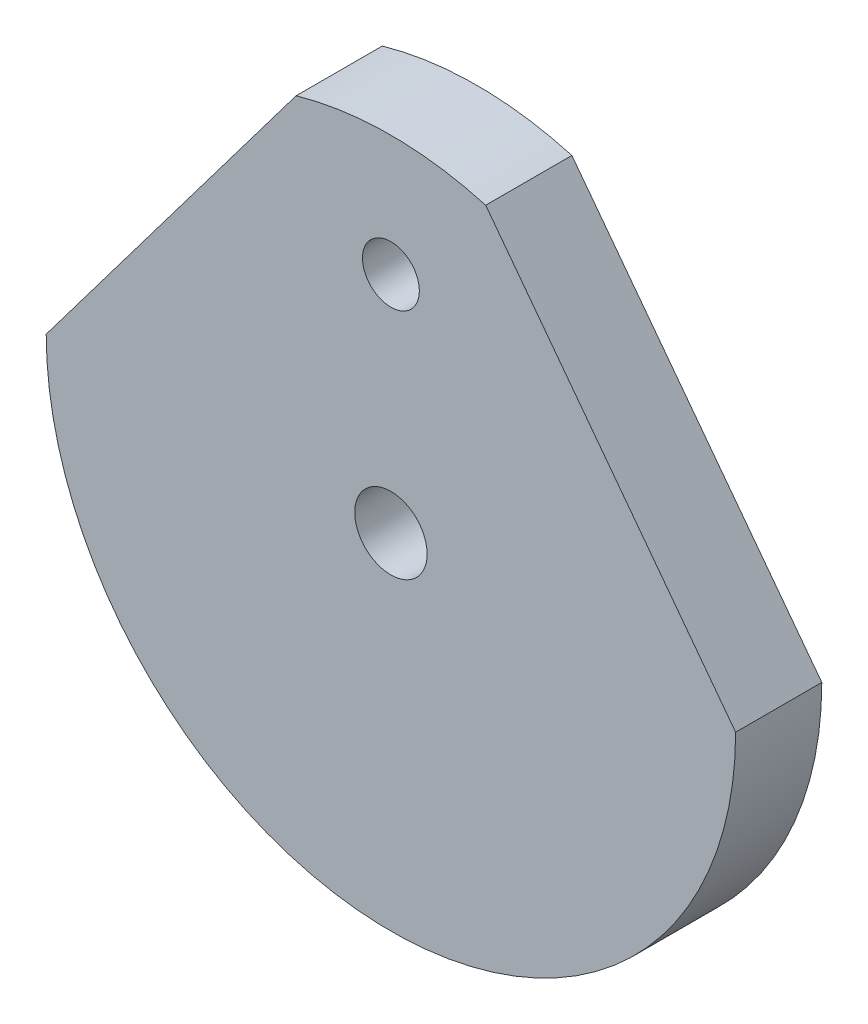
ISO-10303-21;
HEADER;
FILE_DESCRIPTION(('STEP AP214'),'2;1');
FILE_NAME('part.step','',(''),(''),'','','');
FILE_SCHEMA(('AUTOMOTIVE_DESIGN { 1 0 10303 214 1 1 1 1 }'));
ENDSEC;
DATA;
#1=APPLICATION_CONTEXT('core data for automotive mechanical design processes');
#2=APPLICATION_PROTOCOL_DEFINITION('international standard','automotive_design',2000,#1);
#3=PRODUCT_CONTEXT('',#1,'mechanical');
#4=PRODUCT('Part','Part','',(#3));
#5=PRODUCT_RELATED_PRODUCT_CATEGORY('part','',(#4));
#6=PRODUCT_DEFINITION_FORMATION('','',#4);
#7=PRODUCT_DEFINITION_CONTEXT('part definition',#1,'design');
#8=PRODUCT_DEFINITION('design','',#6,#7);
#9=PRODUCT_DEFINITION_SHAPE('','',#8);
#10=(LENGTH_UNIT() NAMED_UNIT(*) SI_UNIT(.MILLI.,.METRE.));
#11=(NAMED_UNIT(*) PLANE_ANGLE_UNIT() SI_UNIT($,.RADIAN.));
#12=(NAMED_UNIT(*) SI_UNIT($,.STERADIAN.) SOLID_ANGLE_UNIT());
#13=UNCERTAINTY_MEASURE_WITH_UNIT(LENGTH_MEASURE(1.E-05),#10,'distance_accuracy_value','');
#14=(GEOMETRIC_REPRESENTATION_CONTEXT(3) GLOBAL_UNCERTAINTY_ASSIGNED_CONTEXT((#13)) GLOBAL_UNIT_ASSIGNED_CONTEXT((#10,
#11,#12)) REPRESENTATION_CONTEXT('',''));
#15=CARTESIAN_POINT('',(0.,0.,0.));
#16=DIRECTION('',(0.,0.,1.));
#17=DIRECTION('',(1.,0.,0.));
#18=AXIS2_PLACEMENT_3D('',#15,#16,#17);
#19=CARTESIAN_POINT('',(12.75,9.6144422615147,2.5));
#20=DIRECTION('',(-0.798435971133566,-0.602079728939615,0.));
#21=DIRECTION('',(0.602079728939615,-0.798435971133566,0.));
#22=AXIS2_PLACEMENT_3D('',#19,#20,#21);
#23=PLANE('',#22);
#24=DIRECTION('',(-0.602079728939615,0.798435971133566,0.));
#25=VECTOR('',#24,1.);
#26=CARTESIAN_POINT('',(12.75,9.6144422615147,-2.5));
#27=LINE('',#26,#25);
#28=CARTESIAN_POINT('',(20.,0.,-2.5));
#29=VERTEX_POINT('',#28);
#30=CARTESIAN_POINT('',(5.5,19.2288845230294,-2.5));
#31=VERTEX_POINT('',#30);
#32=EDGE_CURVE('E101',#29,#31,#27,.T.);
#33=ORIENTED_EDGE('',*,*,#32,.T.);
#34=DIRECTION('',(0.,0.,-1.));
#35=VECTOR('',#34,1.);
#36=CARTESIAN_POINT('',(5.5,19.2288845230294,2.5));
#37=LINE('',#36,#35);
#38=CARTESIAN_POINT('',(5.5,19.2288845230294,2.5));
#39=VERTEX_POINT('',#38);
#40=EDGE_CURVE('E45',#39,#31,#37,.T.);
#41=ORIENTED_EDGE('',*,*,#40,.F.);
#42=DIRECTION('',(-0.602079728939615,0.798435971133566,0.));
#43=VECTOR('',#42,1.);
#44=CARTESIAN_POINT('',(12.75,9.6144422615147,2.5));
#45=LINE('',#44,#43);
#46=CARTESIAN_POINT('',(20.,0.,2.5));
#47=VERTEX_POINT('',#46);
#48=EDGE_CURVE('E85',#47,#39,#45,.T.);
#49=ORIENTED_EDGE('',*,*,#48,.F.);
#50=DIRECTION('',(0.,0.,-1.));
#51=VECTOR('',#50,1.);
#52=CARTESIAN_POINT('',(20.,0.,2.5));
#53=LINE('',#52,#51);
#54=EDGE_CURVE('E98',#47,#29,#53,.T.);
#55=ORIENTED_EDGE('',*,*,#54,.T.);
#56=EDGE_LOOP('',(#33,#41,#49,#55));
#57=FACE_BOUND('',#56,.T.);
#58=ADVANCED_FACE('F36',(#57),#23,.F.);
#59=CARTESIAN_POINT('',(0.,0.,2.5));
#60=DIRECTION('',(0.,0.,-1.));
#61=DIRECTION('',(-1.,0.,0.));
#62=AXIS2_PLACEMENT_3D('',#59,#60,#61);
#63=CYLINDRICAL_SURFACE('',#62,20.);
#64=CARTESIAN_POINT('',(0.,0.,-2.5));
#65=DIRECTION('',(0.,0.,1.));
#66=DIRECTION('',(1.,0.,0.));
#67=AXIS2_PLACEMENT_3D('',#64,#65,#66);
#68=CIRCLE('',#67,20.);
#69=CARTESIAN_POINT('',(-5.5,19.2288845230294,-2.5));
#70=VERTEX_POINT('',#69);
#71=EDGE_CURVE('E91',#31,#70,#68,.T.);
#72=ORIENTED_EDGE('',*,*,#71,.T.);
#73=DIRECTION('',(0.,0.,-1.));
#74=VECTOR('',#73,1.);
#75=CARTESIAN_POINT('',(-5.5,19.2288845230294,2.5));
#76=LINE('',#75,#74);
#77=CARTESIAN_POINT('',(-5.5,19.2288845230294,2.5));
#78=VERTEX_POINT('',#77);
#79=EDGE_CURVE('E89',#78,#70,#76,.T.);
#80=ORIENTED_EDGE('',*,*,#79,.F.);
#81=CARTESIAN_POINT('',(0.,0.,2.5));
#82=DIRECTION('',(0.,0.,1.));
#83=DIRECTION('',(1.,0.,0.));
#84=AXIS2_PLACEMENT_3D('',#81,#82,#83);
#85=CIRCLE('',#84,20.);
#86=EDGE_CURVE('E80',#39,#78,#85,.T.);
#87=ORIENTED_EDGE('',*,*,#86,.F.);
#88=ORIENTED_EDGE('',*,*,#40,.T.);
#89=EDGE_LOOP('',(#72,#80,#87,#88));
#90=FACE_BOUND('',#89,.T.);
#91=ADVANCED_FACE('F90',(#90),#63,.T.);
#92=CARTESIAN_POINT('',(-12.75,9.6144422615147,2.5));
#93=DIRECTION('',(-0.798435971133566,0.602079728939615,0.));
#94=DIRECTION('',(-0.602079728939615,-0.798435971133566,0.));
#95=AXIS2_PLACEMENT_3D('',#92,#93,#94);
#96=PLANE('',#95);
#97=DIRECTION('',(0.602079728939615,0.798435971133566,0.));
#98=VECTOR('',#97,1.);
#99=CARTESIAN_POINT('',(-12.75,9.6144422615147,-2.5));
#100=LINE('',#99,#98);
#101=CARTESIAN_POINT('',(-20.,0.,-2.5));
#102=VERTEX_POINT('',#101);
#103=EDGE_CURVE('E106',#102,#70,#100,.T.);
#104=ORIENTED_EDGE('',*,*,#103,.F.);
#105=DIRECTION('',(0.,0.,-1.));
#106=VECTOR('',#105,1.);
#107=CARTESIAN_POINT('',(-20.,0.,2.5));
#108=LINE('',#107,#106);
#109=CARTESIAN_POINT('',(-20.,0.,2.5));
#110=VERTEX_POINT('',#109);
#111=EDGE_CURVE('E69',#110,#102,#108,.T.);
#112=ORIENTED_EDGE('',*,*,#111,.F.);
#113=DIRECTION('',(0.602079728939615,0.798435971133566,0.));
#114=VECTOR('',#113,1.);
#115=CARTESIAN_POINT('',(-12.75,9.6144422615147,2.5));
#116=LINE('',#115,#114);
#117=EDGE_CURVE('E83',#110,#78,#116,.T.);
#118=ORIENTED_EDGE('',*,*,#117,.T.);
#119=ORIENTED_EDGE('',*,*,#79,.T.);
#120=EDGE_LOOP('',(#104,#112,#118,#119));
#121=FACE_BOUND('',#120,.T.);
#122=ADVANCED_FACE('F96',(#121),#96,.T.);
#123=EDGE_CURVE('E72',#102,#29,#68,.T.);
#124=ORIENTED_EDGE('',*,*,#123,.T.);
#125=ORIENTED_EDGE('',*,*,#54,.F.);
#126=EDGE_CURVE('E53',#110,#47,#85,.T.);
#127=ORIENTED_EDGE('',*,*,#126,.F.);
#128=ORIENTED_EDGE('',*,*,#111,.T.);
#129=EDGE_LOOP('',(#124,#125,#127,#128));
#130=FACE_BOUND('',#129,.T.);
#131=ADVANCED_FACE('F134',(#130),#63,.T.);
#132=CARTESIAN_POINT('',(0.,0.,2.5));
#133=DIRECTION('',(0.,0.,1.));
#134=DIRECTION('',(1.,0.,0.));
#135=AXIS2_PLACEMENT_3D('',#132,#133,#134);
#136=PLANE('',#135);
#137=CARTESIAN_POINT('',(0.,13.,2.5));
#138=DIRECTION('',(0.,0.,1.));
#139=DIRECTION('',(1.,0.,0.));
#140=AXIS2_PLACEMENT_3D('',#137,#138,#139);
#141=CIRCLE('',#140,1.65);
#142=CARTESIAN_POINT('',(1.65,13.,2.5));
#143=VERTEX_POINT('',#142);
#144=EDGE_CURVE('E125',#143,#143,#141,.T.);
#145=ORIENTED_EDGE('',*,*,#144,.F.);
#146=EDGE_LOOP('',(#145));
#147=FACE_BOUND('',#146,.T.);
#148=CARTESIAN_POINT('',(0.,0.,2.5));
#149=DIRECTION('',(0.,0.,1.));
#150=DIRECTION('',(1.,0.,0.));
#151=AXIS2_PLACEMENT_3D('',#148,#149,#150);
#152=CIRCLE('',#151,2.09999999999999);
#153=CARTESIAN_POINT('',(2.09999999999999,0.,2.5));
#154=VERTEX_POINT('',#153);
#155=EDGE_CURVE('E119',#154,#154,#152,.T.);
#156=ORIENTED_EDGE('',*,*,#155,.F.);
#157=EDGE_LOOP('',(#156));
#158=FACE_BOUND('',#157,.T.);
#159=ORIENTED_EDGE('',*,*,#48,.T.);
#160=ORIENTED_EDGE('',*,*,#86,.T.);
#161=ORIENTED_EDGE('',*,*,#117,.F.);
#162=ORIENTED_EDGE('',*,*,#126,.T.);
#163=EDGE_LOOP('',(#159,#160,#161,#162));
#164=FACE_BOUND('',#163,.T.);
#165=ADVANCED_FACE('F81',(#147,#158,#164),#136,.T.);
#166=CARTESIAN_POINT('',(0.,0.,-2.5));
#167=DIRECTION('',(0.,0.,1.));
#168=DIRECTION('',(1.,0.,0.));
#169=AXIS2_PLACEMENT_3D('',#166,#167,#168);
#170=PLANE('',#169);
#171=CARTESIAN_POINT('',(0.,13.,-2.5));
#172=DIRECTION('',(0.,0.,1.));
#173=DIRECTION('',(1.,0.,0.));
#174=AXIS2_PLACEMENT_3D('',#171,#172,#173);
#175=CIRCLE('',#174,1.65);
#176=CARTESIAN_POINT('',(1.65,13.,-2.5));
#177=VERTEX_POINT('',#176);
#178=EDGE_CURVE('E122',#177,#177,#175,.T.);
#179=ORIENTED_EDGE('',*,*,#178,.T.);
#180=EDGE_LOOP('',(#179));
#181=FACE_BOUND('',#180,.T.);
#182=CARTESIAN_POINT('',(0.,0.,-2.5));
#183=DIRECTION('',(0.,0.,1.));
#184=DIRECTION('',(1.,0.,0.));
#185=AXIS2_PLACEMENT_3D('',#182,#183,#184);
#186=CIRCLE('',#185,6.);
#187=CARTESIAN_POINT('',(6.,0.,-2.5));
#188=VERTEX_POINT('',#187);
#189=EDGE_CURVE('E11',#188,#188,#186,.T.);
#190=ORIENTED_EDGE('',*,*,#189,.T.);
#191=EDGE_LOOP('',(#190));
#192=FACE_BOUND('',#191,.T.);
#193=ORIENTED_EDGE('',*,*,#32,.F.);
#194=ORIENTED_EDGE('',*,*,#123,.F.);
#195=ORIENTED_EDGE('',*,*,#103,.T.);
#196=ORIENTED_EDGE('',*,*,#71,.F.);
#197=EDGE_LOOP('',(#193,#194,#195,#196));
#198=FACE_BOUND('',#197,.T.);
#199=ADVANCED_FACE('F112',(#181,#192,#198),#170,.F.);
#200=CARTESIAN_POINT('',(0.,0.,-3.5));
#201=DIRECTION('',(0.,0.,-1.));
#202=DIRECTION('',(-1.,0.,0.));
#203=AXIS2_PLACEMENT_3D('',#200,#201,#202);
#204=PLANE('',#203);
#205=CARTESIAN_POINT('',(0.,0.,-3.5));
#206=DIRECTION('',(0.,0.,1.));
#207=DIRECTION('',(1.,0.,0.));
#208=AXIS2_PLACEMENT_3D('',#205,#206,#207);
#209=CIRCLE('',#208,2.1);
#210=CARTESIAN_POINT('',(2.1,0.,-3.5));
#211=VERTEX_POINT('',#210);
#212=EDGE_CURVE('E116',#211,#211,#209,.T.);
#213=ORIENTED_EDGE('',*,*,#212,.T.);
#214=EDGE_LOOP('',(#213));
#215=FACE_BOUND('',#214,.T.);
#216=CARTESIAN_POINT('',(0.,0.,-3.5));
#217=DIRECTION('',(0.,0.,-1.));
#218=DIRECTION('',(-1.,0.,0.));
#219=AXIS2_PLACEMENT_3D('',#216,#217,#218);
#220=CIRCLE('',#219,5.);
#221=CARTESIAN_POINT('',(-5.,0.,-3.5));
#222=VERTEX_POINT('',#221);
#223=EDGE_CURVE('E104',#222,#222,#220,.T.);
#224=ORIENTED_EDGE('',*,*,#223,.T.);
#225=EDGE_LOOP('',(#224));
#226=FACE_BOUND('',#225,.T.);
#227=ADVANCED_FACE('F147',(#215,#226),#204,.T.);
#228=CARTESIAN_POINT('',(0.,0.,-3.5));
#229=DIRECTION('',(0.,0.,1.));
#230=DIRECTION('',(1.,0.,0.));
#231=AXIS2_PLACEMENT_3D('',#228,#229,#230);
#232=TOROIDAL_SURFACE('',#231,6.,1.);
#233=ORIENTED_EDGE('',*,*,#189,.F.);
#234=EDGE_LOOP('',(#233));
#235=FACE_BOUND('',#234,.T.);
#236=ORIENTED_EDGE('',*,*,#223,.F.);
#237=EDGE_LOOP('',(#236));
#238=FACE_BOUND('',#237,.T.);
#239=ADVANCED_FACE('F38',(#235,#238),#232,.F.);
#240=CARTESIAN_POINT('',(0.,0.,2.5));
#241=DIRECTION('',(0.,0.,1.));
#242=DIRECTION('',(1.,0.,0.));
#243=AXIS2_PLACEMENT_3D('',#240,#241,#242);
#244=CYLINDRICAL_SURFACE('',#243,2.09999999999999);
#245=ORIENTED_EDGE('',*,*,#212,.F.);
#246=EDGE_LOOP('',(#245));
#247=FACE_BOUND('',#246,.T.);
#248=ORIENTED_EDGE('',*,*,#155,.T.);
#249=EDGE_LOOP('',(#248));
#250=FACE_BOUND('',#249,.T.);
#251=ADVANCED_FACE('F138',(#247,#250),#244,.F.);
#252=CARTESIAN_POINT('',(0.,13.,2.5));
#253=DIRECTION('',(0.,0.,1.));
#254=DIRECTION('',(1.,0.,0.));
#255=AXIS2_PLACEMENT_3D('',#252,#253,#254);
#256=CYLINDRICAL_SURFACE('',#255,1.65);
#257=ORIENTED_EDGE('',*,*,#144,.T.);
#258=EDGE_LOOP('',(#257));
#259=FACE_BOUND('',#258,.T.);
#260=ORIENTED_EDGE('',*,*,#178,.F.);
#261=EDGE_LOOP('',(#260));
#262=FACE_BOUND('',#261,.T.);
#263=ADVANCED_FACE('F129',(#259,#262),#256,.F.);
#264=CLOSED_SHELL('',(#58,#91,#122,#131,#165,#199,#227,#239,#251,#263));
#265=MANIFOLD_SOLID_BREP('B2',#264);
#266=ADVANCED_BREP_SHAPE_REPRESENTATION('',(#18,#265),#14);
#267=SHAPE_DEFINITION_REPRESENTATION(#9,#266);
ENDSEC;
END-ISO-10303-21;
